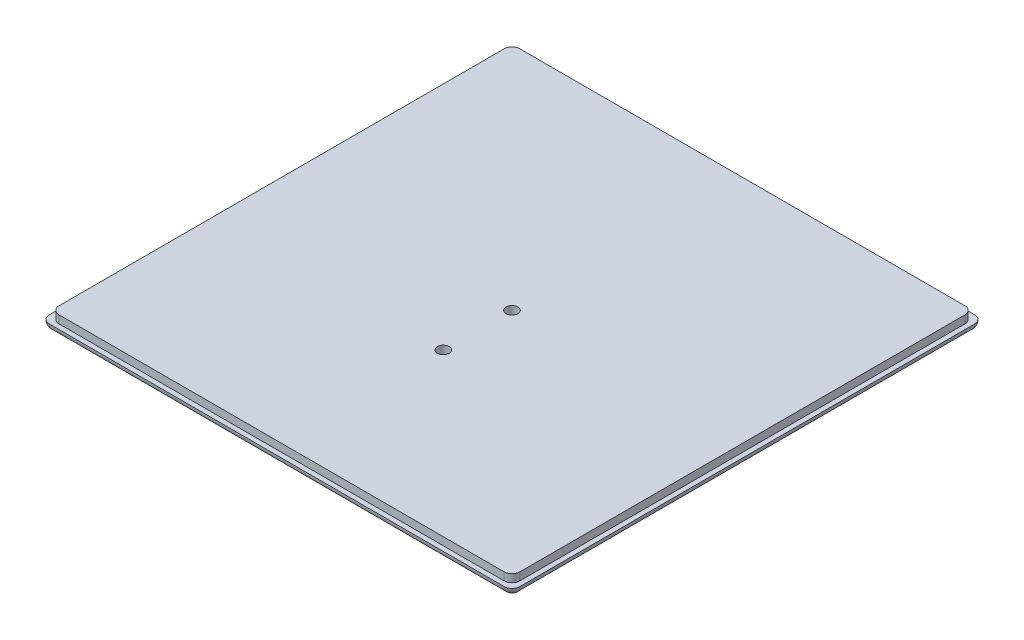
ISO-10303-21;
HEADER;
FILE_DESCRIPTION(('STEP AP214'),'2;1');
FILE_NAME('part.step','',(''),(''),'','','');
FILE_SCHEMA(('AUTOMOTIVE_DESIGN { 1 0 10303 214 1 1 1 1 }'));
ENDSEC;
DATA;
#1=APPLICATION_CONTEXT('core data for automotive mechanical design processes');
#2=APPLICATION_PROTOCOL_DEFINITION('international standard','automotive_design',2000,#1);
#3=PRODUCT_CONTEXT('',#1,'mechanical');
#4=PRODUCT('Part','Part','',(#3));
#5=PRODUCT_RELATED_PRODUCT_CATEGORY('part','',(#4));
#6=PRODUCT_DEFINITION_FORMATION('','',#4);
#7=PRODUCT_DEFINITION_CONTEXT('part definition',#1,'design');
#8=PRODUCT_DEFINITION('design','',#6,#7);
#9=PRODUCT_DEFINITION_SHAPE('','',#8);
#10=(LENGTH_UNIT() NAMED_UNIT(*) SI_UNIT(.MILLI.,.METRE.));
#11=(NAMED_UNIT(*) PLANE_ANGLE_UNIT() SI_UNIT($,.RADIAN.));
#12=(NAMED_UNIT(*) SI_UNIT($,.STERADIAN.) SOLID_ANGLE_UNIT());
#13=UNCERTAINTY_MEASURE_WITH_UNIT(LENGTH_MEASURE(1.E-05),#10,'distance_accuracy_value','');
#14=(GEOMETRIC_REPRESENTATION_CONTEXT(3) GLOBAL_UNCERTAINTY_ASSIGNED_CONTEXT((#13)) GLOBAL_UNIT_ASSIGNED_CONTEXT((#10,
#11,#12)) REPRESENTATION_CONTEXT('',''));
#15=CARTESIAN_POINT('',(0.,0.,0.));
#16=DIRECTION('',(0.,0.,1.));
#17=DIRECTION('',(1.,0.,0.));
#18=AXIS2_PLACEMENT_3D('',#15,#16,#17);
#19=CARTESIAN_POINT('',(0.,2.,0.));
#20=DIRECTION('',(0.,-1.,0.));
#21=DIRECTION('',(0.,0.,-1.));
#22=AXIS2_PLACEMENT_3D('',#19,#20,#21);
#23=PLANE('',#22);
#24=DIRECTION('',(0.,0.,-1.));
#25=VECTOR('',#24,1.);
#26=CARTESIAN_POINT('',(60.,2.,60.));
#27=LINE('',#26,#25);
#28=CARTESIAN_POINT('',(60.,2.,58.));
#29=VERTEX_POINT('',#28);
#30=CARTESIAN_POINT('',(60.,2.,-58.));
#31=VERTEX_POINT('',#30);
#32=EDGE_CURVE('E172',#29,#31,#27,.T.);
#33=ORIENTED_EDGE('',*,*,#32,.T.);
#34=CARTESIAN_POINT('',(58.,2.,-58.));
#35=DIRECTION('',(0.,-1.,0.));
#36=DIRECTION('',(0.,0.,-1.));
#37=AXIS2_PLACEMENT_3D('',#34,#35,#36);
#38=CIRCLE('',#37,2.);
#39=CARTESIAN_POINT('',(58.,2.,-60.));
#40=VERTEX_POINT('',#39);
#41=EDGE_CURVE('E186',#31,#40,#38,.F.);
#42=ORIENTED_EDGE('',*,*,#41,.T.);
#43=DIRECTION('',(-1.,0.,0.));
#44=VECTOR('',#43,1.);
#45=CARTESIAN_POINT('',(-60.,2.,-60.));
#46=LINE('',#45,#44);
#47=CARTESIAN_POINT('',(-58.,2.,-60.));
#48=VERTEX_POINT('',#47);
#49=EDGE_CURVE('E149',#40,#48,#46,.T.);
#50=ORIENTED_EDGE('',*,*,#49,.T.);
#51=CARTESIAN_POINT('',(-58.,2.,-58.));
#52=DIRECTION('',(0.,-1.,0.));
#53=DIRECTION('',(0.,0.,-1.));
#54=AXIS2_PLACEMENT_3D('',#51,#52,#53);
#55=CIRCLE('',#54,2.);
#56=CARTESIAN_POINT('',(-60.,2.,-58.));
#57=VERTEX_POINT('',#56);
#58=EDGE_CURVE('E143',#48,#57,#55,.F.);
#59=ORIENTED_EDGE('',*,*,#58,.T.);
#60=DIRECTION('',(0.,0.,1.));
#61=VECTOR('',#60,1.);
#62=CARTESIAN_POINT('',(-60.,2.,60.));
#63=LINE('',#62,#61);
#64=CARTESIAN_POINT('',(-60.,2.,58.));
#65=VERTEX_POINT('',#64);
#66=EDGE_CURVE('E147',#57,#65,#63,.T.);
#67=ORIENTED_EDGE('',*,*,#66,.T.);
#68=CARTESIAN_POINT('',(-58.,2.,58.));
#69=DIRECTION('',(0.,-1.,0.));
#70=DIRECTION('',(0.,0.,-1.));
#71=AXIS2_PLACEMENT_3D('',#68,#69,#70);
#72=CIRCLE('',#71,2.);
#73=CARTESIAN_POINT('',(-58.,2.,60.));
#74=VERTEX_POINT('',#73);
#75=EDGE_CURVE('E153',#65,#74,#72,.F.);
#76=ORIENTED_EDGE('',*,*,#75,.T.);
#77=DIRECTION('',(1.,0.,0.));
#78=VECTOR('',#77,1.);
#79=CARTESIAN_POINT('',(-60.,2.,60.));
#80=LINE('',#79,#78);
#81=CARTESIAN_POINT('',(58.,2.,60.));
#82=VERTEX_POINT('',#81);
#83=EDGE_CURVE('E168',#74,#82,#80,.T.);
#84=ORIENTED_EDGE('',*,*,#83,.T.);
#85=CARTESIAN_POINT('',(58.,2.,58.));
#86=DIRECTION('',(0.,-1.,0.));
#87=DIRECTION('',(0.,0.,-1.));
#88=AXIS2_PLACEMENT_3D('',#85,#86,#87);
#89=CIRCLE('',#88,2.);
#90=EDGE_CURVE('E184',#82,#29,#89,.F.);
#91=ORIENTED_EDGE('',*,*,#90,.T.);
#92=EDGE_LOOP('',(#33,#42,#50,#59,#67,#76,#84,#91));
#93=FACE_BOUND('',#92,.T.);
#94=DIRECTION('',(0.,0.,-1.));
#95=VECTOR('',#94,1.);
#96=CARTESIAN_POINT('',(58.75,2.,58.75));
#97=LINE('',#96,#95);
#98=CARTESIAN_POINT('',(58.75,2.,56.75));
#99=VERTEX_POINT('',#98);
#100=CARTESIAN_POINT('',(58.75,2.,-56.75));
#101=VERTEX_POINT('',#100);
#102=EDGE_CURVE('E236',#99,#101,#97,.T.);
#103=ORIENTED_EDGE('',*,*,#102,.F.);
#104=CARTESIAN_POINT('',(56.75,2.,56.75));
#105=DIRECTION('',(0.,-1.,0.));
#106=DIRECTION('',(0.,0.,-1.));
#107=AXIS2_PLACEMENT_3D('',#104,#105,#106);
#108=CIRCLE('',#107,2.);
#109=CARTESIAN_POINT('',(56.75,2.,58.75));
#110=VERTEX_POINT('',#109);
#111=EDGE_CURVE('E48',#99,#110,#108,.T.);
#112=ORIENTED_EDGE('',*,*,#111,.T.);
#113=DIRECTION('',(1.,0.,0.));
#114=VECTOR('',#113,1.);
#115=CARTESIAN_POINT('',(-58.75,2.,58.75));
#116=LINE('',#115,#114);
#117=CARTESIAN_POINT('',(-56.75,2.,58.75));
#118=VERTEX_POINT('',#117);
#119=EDGE_CURVE('E256',#118,#110,#116,.T.);
#120=ORIENTED_EDGE('',*,*,#119,.F.);
#121=CARTESIAN_POINT('',(-56.75,2.,56.75));
#122=DIRECTION('',(0.,-1.,0.));
#123=DIRECTION('',(0.,0.,-1.));
#124=AXIS2_PLACEMENT_3D('',#121,#122,#123);
#125=CIRCLE('',#124,2.);
#126=CARTESIAN_POINT('',(-58.75,2.,56.75));
#127=VERTEX_POINT('',#126);
#128=EDGE_CURVE('E11',#118,#127,#125,.T.);
#129=ORIENTED_EDGE('',*,*,#128,.T.);
#130=DIRECTION('',(0.,0.,1.));
#131=VECTOR('',#130,1.);
#132=CARTESIAN_POINT('',(-58.75,2.,58.75));
#133=LINE('',#132,#131);
#134=CARTESIAN_POINT('',(-58.75,2.,-56.75));
#135=VERTEX_POINT('',#134);
#136=EDGE_CURVE('E248',#135,#127,#133,.T.);
#137=ORIENTED_EDGE('',*,*,#136,.F.);
#138=CARTESIAN_POINT('',(-56.75,2.,-56.75));
#139=DIRECTION('',(0.,-1.,0.));
#140=DIRECTION('',(0.,0.,-1.));
#141=AXIS2_PLACEMENT_3D('',#138,#139,#140);
#142=CIRCLE('',#141,2.);
#143=CARTESIAN_POINT('',(-56.75,2.,-58.75));
#144=VERTEX_POINT('',#143);
#145=EDGE_CURVE('E214',#135,#144,#142,.T.);
#146=ORIENTED_EDGE('',*,*,#145,.T.);
#147=DIRECTION('',(-1.,0.,0.));
#148=VECTOR('',#147,1.);
#149=CARTESIAN_POINT('',(-58.75,2.,-58.75));
#150=LINE('',#149,#148);
#151=CARTESIAN_POINT('',(56.75,2.,-58.75));
#152=VERTEX_POINT('',#151);
#153=EDGE_CURVE('E242',#152,#144,#150,.T.);
#154=ORIENTED_EDGE('',*,*,#153,.F.);
#155=CARTESIAN_POINT('',(56.75,2.,-56.75));
#156=DIRECTION('',(0.,-1.,0.));
#157=DIRECTION('',(0.,0.,-1.));
#158=AXIS2_PLACEMENT_3D('',#155,#156,#157);
#159=CIRCLE('',#158,2.);
#160=EDGE_CURVE('E216',#152,#101,#159,.T.);
#161=ORIENTED_EDGE('',*,*,#160,.T.);
#162=EDGE_LOOP('',(#103,#112,#120,#129,#137,#146,#154,#161));
#163=FACE_BOUND('',#162,.T.);
#164=ADVANCED_FACE('F39',(#93,#163),#23,.F.);
#165=CARTESIAN_POINT('',(0.,0.,0.));
#166=DIRECTION('',(0.,-1.,0.));
#167=DIRECTION('',(0.,0.,-1.));
#168=AXIS2_PLACEMENT_3D('',#165,#166,#167);
#169=PLANE('',#168);
#170=CARTESIAN_POINT('',(0.,0.,0.));
#171=DIRECTION('',(0.,-1.,0.));
#172=DIRECTION('',(0.,0.,-1.));
#173=AXIS2_PLACEMENT_3D('',#170,#171,#172);
#174=CIRCLE('',#173,1.5);
#175=CARTESIAN_POINT('',(0.,0.,-1.5));
#176=VERTEX_POINT('',#175);
#177=EDGE_CURVE('E274',#176,#176,#174,.T.);
#178=ORIENTED_EDGE('',*,*,#177,.F.);
#179=EDGE_LOOP('',(#178));
#180=FACE_BOUND('',#179,.T.);
#181=CARTESIAN_POINT('',(0.,0.,17.5));
#182=DIRECTION('',(0.,-1.,0.));
#183=DIRECTION('',(0.,0.,-1.));
#184=AXIS2_PLACEMENT_3D('',#181,#182,#183);
#185=CIRCLE('',#184,1.5);
#186=CARTESIAN_POINT('',(0.,0.,16.));
#187=VERTEX_POINT('',#186);
#188=EDGE_CURVE('E271',#187,#187,#185,.T.);
#189=ORIENTED_EDGE('',*,*,#188,.F.);
#190=EDGE_LOOP('',(#189));
#191=FACE_BOUND('',#190,.T.);
#192=DIRECTION('',(1.,0.,0.));
#193=VECTOR('',#192,1.);
#194=CARTESIAN_POINT('',(-60.,0.,58.));
#195=LINE('',#194,#193);
#196=CARTESIAN_POINT('',(58.,0.,58.));
#197=VERTEX_POINT('',#196);
#198=CARTESIAN_POINT('',(-58.,0.,58.));
#199=VERTEX_POINT('',#198);
#200=EDGE_CURVE('E179',#197,#199,#195,.F.);
#201=ORIENTED_EDGE('',*,*,#200,.T.);
#202=DIRECTION('',(0.,0.,1.));
#203=VECTOR('',#202,1.);
#204=CARTESIAN_POINT('',(-58.,0.,-60.));
#205=LINE('',#204,#203);
#206=CARTESIAN_POINT('',(-58.,0.,-58.));
#207=VERTEX_POINT('',#206);
#208=EDGE_CURVE('E154',#199,#207,#205,.F.);
#209=ORIENTED_EDGE('',*,*,#208,.T.);
#210=DIRECTION('',(-1.,0.,0.));
#211=VECTOR('',#210,1.);
#212=CARTESIAN_POINT('',(60.,0.,-58.));
#213=LINE('',#212,#211);
#214=CARTESIAN_POINT('',(58.,0.,-58.));
#215=VERTEX_POINT('',#214);
#216=EDGE_CURVE('E177',#207,#215,#213,.F.);
#217=ORIENTED_EDGE('',*,*,#216,.T.);
#218=DIRECTION('',(0.,0.,-1.));
#219=VECTOR('',#218,1.);
#220=CARTESIAN_POINT('',(58.,0.,60.));
#221=LINE('',#220,#219);
#222=EDGE_CURVE('E170',#215,#197,#221,.F.);
#223=ORIENTED_EDGE('',*,*,#222,.T.);
#224=EDGE_LOOP('',(#201,#209,#217,#223));
#225=FACE_BOUND('',#224,.T.);
#226=ADVANCED_FACE('F290',(#180,#191,#225),#169,.T.);
#227=CARTESIAN_POINT('',(58.75,4.,58.75));
#228=DIRECTION('',(-1.,0.,0.));
#229=DIRECTION('',(0.,0.,1.));
#230=AXIS2_PLACEMENT_3D('',#227,#228,#229);
#231=PLANE('',#230);
#232=ORIENTED_EDGE('',*,*,#102,.T.);
#233=DIRECTION('',(0.,-1.,0.));
#234=VECTOR('',#233,1.);
#235=CARTESIAN_POINT('',(58.75,4.,-56.75));
#236=LINE('',#235,#234);
#237=CARTESIAN_POINT('',(58.75,4.,-56.75));
#238=VERTEX_POINT('',#237);
#239=EDGE_CURVE('E208',#101,#238,#236,.F.);
#240=ORIENTED_EDGE('',*,*,#239,.T.);
#241=DIRECTION('',(0.,0.,-1.));
#242=VECTOR('',#241,1.);
#243=CARTESIAN_POINT('',(58.75,4.,58.75));
#244=LINE('',#243,#242);
#245=CARTESIAN_POINT('',(58.75,4.,56.75));
#246=VERTEX_POINT('',#245);
#247=EDGE_CURVE('E257',#246,#238,#244,.T.);
#248=ORIENTED_EDGE('',*,*,#247,.F.);
#249=DIRECTION('',(0.,-1.,0.));
#250=VECTOR('',#249,1.);
#251=CARTESIAN_POINT('',(58.75,4.,56.75));
#252=LINE('',#251,#250);
#253=EDGE_CURVE('E205',#246,#99,#252,.T.);
#254=ORIENTED_EDGE('',*,*,#253,.T.);
#255=EDGE_LOOP('',(#232,#240,#248,#254));
#256=FACE_BOUND('',#255,.T.);
#257=ADVANCED_FACE('F293',(#256),#231,.F.);
#258=CARTESIAN_POINT('',(-58.75,4.,-58.75));
#259=DIRECTION('',(0.,0.,1.));
#260=DIRECTION('',(1.,0.,0.));
#261=AXIS2_PLACEMENT_3D('',#258,#259,#260);
#262=PLANE('',#261);
#263=ORIENTED_EDGE('',*,*,#153,.T.);
#264=DIRECTION('',(0.,-1.,0.));
#265=VECTOR('',#264,1.);
#266=CARTESIAN_POINT('',(-56.75,4.,-58.75));
#267=LINE('',#266,#265);
#268=CARTESIAN_POINT('',(-56.75,4.,-58.75));
#269=VERTEX_POINT('',#268);
#270=EDGE_CURVE('E196',#144,#269,#267,.F.);
#271=ORIENTED_EDGE('',*,*,#270,.T.);
#272=DIRECTION('',(-1.,0.,0.));
#273=VECTOR('',#272,1.);
#274=CARTESIAN_POINT('',(-58.75,4.,-58.75));
#275=LINE('',#274,#273);
#276=CARTESIAN_POINT('',(56.75,4.,-58.75));
#277=VERTEX_POINT('',#276);
#278=EDGE_CURVE('E261',#277,#269,#275,.T.);
#279=ORIENTED_EDGE('',*,*,#278,.F.);
#280=DIRECTION('',(0.,-1.,0.));
#281=VECTOR('',#280,1.);
#282=CARTESIAN_POINT('',(56.75,4.,-58.75));
#283=LINE('',#282,#281);
#284=EDGE_CURVE('E193',#277,#152,#283,.T.);
#285=ORIENTED_EDGE('',*,*,#284,.T.);
#286=EDGE_LOOP('',(#263,#271,#279,#285));
#287=FACE_BOUND('',#286,.T.);
#288=ADVANCED_FACE('F460',(#287),#262,.F.);
#289=CARTESIAN_POINT('',(-58.75,4.,58.75));
#290=DIRECTION('',(1.,0.,0.));
#291=DIRECTION('',(0.,0.,-1.));
#292=AXIS2_PLACEMENT_3D('',#289,#290,#291);
#293=PLANE('',#292);
#294=DIRECTION('',(0.,0.,1.));
#295=VECTOR('',#294,1.);
#296=CARTESIAN_POINT('',(-58.75,4.,58.75));
#297=LINE('',#296,#295);
#298=CARTESIAN_POINT('',(-58.75,4.,-56.75));
#299=VERTEX_POINT('',#298);
#300=CARTESIAN_POINT('',(-58.75,4.,56.75));
#301=VERTEX_POINT('',#300);
#302=EDGE_CURVE('E259',#299,#301,#297,.T.);
#303=ORIENTED_EDGE('',*,*,#302,.F.);
#304=DIRECTION('',(0.,-1.,0.));
#305=VECTOR('',#304,1.);
#306=CARTESIAN_POINT('',(-58.75,4.,-56.75));
#307=LINE('',#306,#305);
#308=EDGE_CURVE('E190',#299,#135,#307,.T.);
#309=ORIENTED_EDGE('',*,*,#308,.T.);
#310=ORIENTED_EDGE('',*,*,#136,.T.);
#311=DIRECTION('',(0.,-1.,0.));
#312=VECTOR('',#311,1.);
#313=CARTESIAN_POINT('',(-58.75,4.,56.75));
#314=LINE('',#313,#312);
#315=EDGE_CURVE('E188',#127,#301,#314,.F.);
#316=ORIENTED_EDGE('',*,*,#315,.T.);
#317=EDGE_LOOP('',(#303,#309,#310,#316));
#318=FACE_BOUND('',#317,.T.);
#319=ADVANCED_FACE('F452',(#318),#293,.F.);
#320=CARTESIAN_POINT('',(-58.75,4.,58.75));
#321=DIRECTION('',(0.,0.,-1.));
#322=DIRECTION('',(-1.,0.,0.));
#323=AXIS2_PLACEMENT_3D('',#320,#321,#322);
#324=PLANE('',#323);
#325=ORIENTED_EDGE('',*,*,#119,.T.);
#326=DIRECTION('',(0.,-1.,0.));
#327=VECTOR('',#326,1.);
#328=CARTESIAN_POINT('',(56.75,4.,58.75));
#329=LINE('',#328,#327);
#330=CARTESIAN_POINT('',(56.75,4.,58.75));
#331=VERTEX_POINT('',#330);
#332=EDGE_CURVE('E56',#110,#331,#329,.F.);
#333=ORIENTED_EDGE('',*,*,#332,.T.);
#334=DIRECTION('',(1.,0.,0.));
#335=VECTOR('',#334,1.);
#336=CARTESIAN_POINT('',(-58.75,4.,58.75));
#337=LINE('',#336,#335);
#338=CARTESIAN_POINT('',(-56.75,4.,58.75));
#339=VERTEX_POINT('',#338);
#340=EDGE_CURVE('E251',#339,#331,#337,.T.);
#341=ORIENTED_EDGE('',*,*,#340,.F.);
#342=DIRECTION('',(0.,-1.,0.));
#343=VECTOR('',#342,1.);
#344=CARTESIAN_POINT('',(-56.75,4.,58.75));
#345=LINE('',#344,#343);
#346=EDGE_CURVE('E210',#339,#118,#345,.T.);
#347=ORIENTED_EDGE('',*,*,#346,.T.);
#348=EDGE_LOOP('',(#325,#333,#341,#347));
#349=FACE_BOUND('',#348,.T.);
#350=ADVANCED_FACE('F399',(#349),#324,.F.);
#351=CARTESIAN_POINT('',(0.,4.,0.));
#352=DIRECTION('',(0.,-1.,0.));
#353=DIRECTION('',(0.,0.,-1.));
#354=AXIS2_PLACEMENT_3D('',#351,#352,#353);
#355=PLANE('',#354);
#356=CARTESIAN_POINT('',(0.,4.,0.));
#357=DIRECTION('',(0.,-1.,0.));
#358=DIRECTION('',(0.,0.,-1.));
#359=AXIS2_PLACEMENT_3D('',#356,#357,#358);
#360=CIRCLE('',#359,1.5);
#361=CARTESIAN_POINT('',(0.,4.,-1.5));
#362=VERTEX_POINT('',#361);
#363=EDGE_CURVE('E219',#362,#362,#360,.T.);
#364=ORIENTED_EDGE('',*,*,#363,.T.);
#365=EDGE_LOOP('',(#364));
#366=FACE_BOUND('',#365,.T.);
#367=CARTESIAN_POINT('',(0.,4.,17.5));
#368=DIRECTION('',(0.,-1.,0.));
#369=DIRECTION('',(0.,0.,-1.));
#370=AXIS2_PLACEMENT_3D('',#367,#368,#369);
#371=CIRCLE('',#370,1.5);
#372=CARTESIAN_POINT('',(0.,4.,16.));
#373=VERTEX_POINT('',#372);
#374=EDGE_CURVE('E268',#373,#373,#371,.T.);
#375=ORIENTED_EDGE('',*,*,#374,.T.);
#376=EDGE_LOOP('',(#375));
#377=FACE_BOUND('',#376,.T.);
#378=ORIENTED_EDGE('',*,*,#278,.T.);
#379=CARTESIAN_POINT('',(-56.75,4.,-56.75));
#380=DIRECTION('',(0.,-1.,0.));
#381=DIRECTION('',(0.,0.,-1.));
#382=AXIS2_PLACEMENT_3D('',#379,#380,#381);
#383=CIRCLE('',#382,2.);
#384=EDGE_CURVE('E203',#269,#299,#383,.F.);
#385=ORIENTED_EDGE('',*,*,#384,.T.);
#386=ORIENTED_EDGE('',*,*,#302,.T.);
#387=CARTESIAN_POINT('',(-56.75,4.,56.75));
#388=DIRECTION('',(0.,-1.,0.));
#389=DIRECTION('',(0.,0.,-1.));
#390=AXIS2_PLACEMENT_3D('',#387,#388,#389);
#391=CIRCLE('',#390,2.);
#392=EDGE_CURVE('E63',#301,#339,#391,.F.);
#393=ORIENTED_EDGE('',*,*,#392,.T.);
#394=ORIENTED_EDGE('',*,*,#340,.T.);
#395=CARTESIAN_POINT('',(56.75,4.,56.75));
#396=DIRECTION('',(0.,-1.,0.));
#397=DIRECTION('',(0.,0.,-1.));
#398=AXIS2_PLACEMENT_3D('',#395,#396,#397);
#399=CIRCLE('',#398,2.);
#400=EDGE_CURVE('E199',#331,#246,#399,.F.);
#401=ORIENTED_EDGE('',*,*,#400,.T.);
#402=ORIENTED_EDGE('',*,*,#247,.T.);
#403=CARTESIAN_POINT('',(56.75,4.,-56.75));
#404=DIRECTION('',(0.,-1.,0.));
#405=DIRECTION('',(0.,0.,-1.));
#406=AXIS2_PLACEMENT_3D('',#403,#404,#405);
#407=CIRCLE('',#406,2.);
#408=EDGE_CURVE('E201',#238,#277,#407,.F.);
#409=ORIENTED_EDGE('',*,*,#408,.T.);
#410=EDGE_LOOP('',(#378,#385,#386,#393,#394,#401,#402,#409));
#411=FACE_BOUND('',#410,.T.);
#412=ADVANCED_FACE('F280',(#366,#377,#411),#355,.F.);
#413=CARTESIAN_POINT('',(58.,2.,60.));
#414=DIRECTION('',(0.,0.,1.));
#415=DIRECTION('',(1.,0.,0.));
#416=AXIS2_PLACEMENT_3D('',#413,#414,#415);
#417=CYLINDRICAL_SURFACE('',#416,2.);
#418=CARTESIAN_POINT('',(58.,2.,-58.));
#419=DIRECTION('',(0.,0.,-1.));
#420=DIRECTION('',(-1.,0.,0.));
#421=AXIS2_PLACEMENT_3D('',#418,#419,#420);
#422=CIRCLE('',#421,2.);
#423=EDGE_CURVE('E43',#31,#215,#422,.T.);
#424=ORIENTED_EDGE('',*,*,#423,.F.);
#425=ORIENTED_EDGE('',*,*,#32,.F.);
#426=CARTESIAN_POINT('',(58.,2.,58.));
#427=DIRECTION('',(0.,0.,1.));
#428=DIRECTION('',(1.,0.,0.));
#429=AXIS2_PLACEMENT_3D('',#426,#427,#428);
#430=CIRCLE('',#429,2.);
#431=EDGE_CURVE('E229',#197,#29,#430,.T.);
#432=ORIENTED_EDGE('',*,*,#431,.F.);
#433=ORIENTED_EDGE('',*,*,#222,.F.);
#434=EDGE_LOOP('',(#424,#425,#432,#433));
#435=FACE_BOUND('',#434,.T.);
#436=ADVANCED_FACE('F316',(#435),#417,.T.);
#437=CARTESIAN_POINT('',(58.,2.,-58.));
#438=DIRECTION('',(1.,0.,0.));
#439=DIRECTION('',(0.,0.,-1.));
#440=AXIS2_PLACEMENT_3D('',#437,#438,#439);
#441=SPHERICAL_SURFACE('',#440,2.);
#442=ORIENTED_EDGE('',*,*,#41,.F.);
#443=ORIENTED_EDGE('',*,*,#423,.T.);
#444=CARTESIAN_POINT('',(58.,2.,-58.));
#445=DIRECTION('',(1.,0.,0.));
#446=DIRECTION('',(0.,0.,-1.));
#447=AXIS2_PLACEMENT_3D('',#444,#445,#446);
#448=CIRCLE('',#447,2.);
#449=EDGE_CURVE('E227',#40,#215,#448,.F.);
#450=ORIENTED_EDGE('',*,*,#449,.F.);
#451=EDGE_LOOP('',(#442,#443,#450));
#452=FACE_BOUND('',#451,.T.);
#453=ADVANCED_FACE('F308',(#452),#441,.T.);
#454=CARTESIAN_POINT('',(58.,2.,58.));
#455=DIRECTION('',(1.,0.,0.));
#456=DIRECTION('',(0.,0.,-1.));
#457=AXIS2_PLACEMENT_3D('',#454,#455,#456);
#458=SPHERICAL_SURFACE('',#457,2.);
#459=ORIENTED_EDGE('',*,*,#431,.T.);
#460=ORIENTED_EDGE('',*,*,#90,.F.);
#461=CARTESIAN_POINT('',(58.,2.,58.));
#462=DIRECTION('',(1.,0.,0.));
#463=DIRECTION('',(0.,0.,-1.));
#464=AXIS2_PLACEMENT_3D('',#461,#462,#463);
#465=CIRCLE('',#464,2.);
#466=EDGE_CURVE('E224',#197,#82,#465,.F.);
#467=ORIENTED_EDGE('',*,*,#466,.F.);
#468=EDGE_LOOP('',(#459,#460,#467));
#469=FACE_BOUND('',#468,.T.);
#470=ADVANCED_FACE('F305',(#469),#458,.T.);
#471=CARTESIAN_POINT('',(-60.,2.,-58.));
#472=DIRECTION('',(1.,0.,0.));
#473=DIRECTION('',(0.,0.,-1.));
#474=AXIS2_PLACEMENT_3D('',#471,#472,#473);
#475=CYLINDRICAL_SURFACE('',#474,2.);
#476=ORIENTED_EDGE('',*,*,#449,.T.);
#477=ORIENTED_EDGE('',*,*,#216,.F.);
#478=CARTESIAN_POINT('',(-58.,2.,-58.));
#479=DIRECTION('',(-1.,0.,0.));
#480=DIRECTION('',(0.,0.,1.));
#481=AXIS2_PLACEMENT_3D('',#478,#479,#480);
#482=CIRCLE('',#481,2.);
#483=EDGE_CURVE('E158',#48,#207,#482,.T.);
#484=ORIENTED_EDGE('',*,*,#483,.F.);
#485=ORIENTED_EDGE('',*,*,#49,.F.);
#486=EDGE_LOOP('',(#476,#477,#484,#485));
#487=FACE_BOUND('',#486,.T.);
#488=ADVANCED_FACE('F307',(#487),#475,.T.);
#489=CARTESIAN_POINT('',(-60.,2.,58.));
#490=DIRECTION('',(-1.,0.,0.));
#491=DIRECTION('',(0.,0.,1.));
#492=AXIS2_PLACEMENT_3D('',#489,#490,#491);
#493=CYLINDRICAL_SURFACE('',#492,2.);
#494=ORIENTED_EDGE('',*,*,#466,.T.);
#495=ORIENTED_EDGE('',*,*,#83,.F.);
#496=CARTESIAN_POINT('',(-58.,2.,58.));
#497=DIRECTION('',(-1.,0.,0.));
#498=DIRECTION('',(0.,0.,1.));
#499=AXIS2_PLACEMENT_3D('',#496,#497,#498);
#500=CIRCLE('',#499,2.);
#501=EDGE_CURVE('E162',#199,#74,#500,.T.);
#502=ORIENTED_EDGE('',*,*,#501,.F.);
#503=ORIENTED_EDGE('',*,*,#200,.F.);
#504=EDGE_LOOP('',(#494,#495,#502,#503));
#505=FACE_BOUND('',#504,.T.);
#506=ADVANCED_FACE('F302',(#505),#493,.T.);
#507=CARTESIAN_POINT('',(-58.,2.,-58.));
#508=DIRECTION('',(0.,0.,-1.));
#509=DIRECTION('',(-1.,0.,0.));
#510=AXIS2_PLACEMENT_3D('',#507,#508,#509);
#511=SPHERICAL_SURFACE('',#510,2.);
#512=ORIENTED_EDGE('',*,*,#58,.F.);
#513=ORIENTED_EDGE('',*,*,#483,.T.);
#514=CARTESIAN_POINT('',(-58.,2.,-58.));
#515=DIRECTION('',(0.,0.,-1.));
#516=DIRECTION('',(-1.,0.,0.));
#517=AXIS2_PLACEMENT_3D('',#514,#515,#516);
#518=CIRCLE('',#517,2.);
#519=EDGE_CURVE('E156',#57,#207,#518,.F.);
#520=ORIENTED_EDGE('',*,*,#519,.F.);
#521=EDGE_LOOP('',(#512,#513,#520));
#522=FACE_BOUND('',#521,.T.);
#523=ADVANCED_FACE('F157',(#522),#511,.T.);
#524=CARTESIAN_POINT('',(-58.,2.,58.));
#525=DIRECTION('',(0.,0.,1.));
#526=DIRECTION('',(1.,0.,0.));
#527=AXIS2_PLACEMENT_3D('',#524,#525,#526);
#528=SPHERICAL_SURFACE('',#527,2.);
#529=ORIENTED_EDGE('',*,*,#501,.T.);
#530=ORIENTED_EDGE('',*,*,#75,.F.);
#531=CARTESIAN_POINT('',(-58.,2.,58.));
#532=DIRECTION('',(0.,0.,1.));
#533=DIRECTION('',(1.,0.,0.));
#534=AXIS2_PLACEMENT_3D('',#531,#532,#533);
#535=CIRCLE('',#534,2.);
#536=EDGE_CURVE('E163',#199,#65,#535,.F.);
#537=ORIENTED_EDGE('',*,*,#536,.F.);
#538=EDGE_LOOP('',(#529,#530,#537));
#539=FACE_BOUND('',#538,.T.);
#540=ADVANCED_FACE('F304',(#539),#528,.T.);
#541=CARTESIAN_POINT('',(-58.,2.,60.));
#542=DIRECTION('',(0.,0.,-1.));
#543=DIRECTION('',(-1.,0.,0.));
#544=AXIS2_PLACEMENT_3D('',#541,#542,#543);
#545=CYLINDRICAL_SURFACE('',#544,2.);
#546=ORIENTED_EDGE('',*,*,#519,.T.);
#547=ORIENTED_EDGE('',*,*,#208,.F.);
#548=ORIENTED_EDGE('',*,*,#536,.T.);
#549=ORIENTED_EDGE('',*,*,#66,.F.);
#550=EDGE_LOOP('',(#546,#547,#548,#549));
#551=FACE_BOUND('',#550,.T.);
#552=ADVANCED_FACE('F165',(#551),#545,.T.);
#553=CARTESIAN_POINT('',(-56.75,4.,-56.75));
#554=DIRECTION('',(0.,-1.,0.));
#555=DIRECTION('',(0.,0.,-1.));
#556=AXIS2_PLACEMENT_3D('',#553,#554,#555);
#557=CYLINDRICAL_SURFACE('',#556,2.);
#558=ORIENTED_EDGE('',*,*,#384,.F.);
#559=ORIENTED_EDGE('',*,*,#270,.F.);
#560=ORIENTED_EDGE('',*,*,#145,.F.);
#561=ORIENTED_EDGE('',*,*,#308,.F.);
#562=EDGE_LOOP('',(#558,#559,#560,#561));
#563=FACE_BOUND('',#562,.T.);
#564=ADVANCED_FACE('F328',(#563),#557,.T.);
#565=CARTESIAN_POINT('',(56.75,4.,-56.75));
#566=DIRECTION('',(0.,-1.,0.));
#567=DIRECTION('',(0.,0.,-1.));
#568=AXIS2_PLACEMENT_3D('',#565,#566,#567);
#569=CYLINDRICAL_SURFACE('',#568,2.);
#570=ORIENTED_EDGE('',*,*,#408,.F.);
#571=ORIENTED_EDGE('',*,*,#239,.F.);
#572=ORIENTED_EDGE('',*,*,#160,.F.);
#573=ORIENTED_EDGE('',*,*,#284,.F.);
#574=EDGE_LOOP('',(#570,#571,#572,#573));
#575=FACE_BOUND('',#574,.T.);
#576=ADVANCED_FACE('F360',(#575),#569,.T.);
#577=CARTESIAN_POINT('',(56.75,4.,56.75));
#578=DIRECTION('',(0.,-1.,0.));
#579=DIRECTION('',(0.,0.,-1.));
#580=AXIS2_PLACEMENT_3D('',#577,#578,#579);
#581=CYLINDRICAL_SURFACE('',#580,2.);
#582=ORIENTED_EDGE('',*,*,#400,.F.);
#583=ORIENTED_EDGE('',*,*,#332,.F.);
#584=ORIENTED_EDGE('',*,*,#111,.F.);
#585=ORIENTED_EDGE('',*,*,#253,.F.);
#586=EDGE_LOOP('',(#582,#583,#584,#585));
#587=FACE_BOUND('',#586,.T.);
#588=ADVANCED_FACE('F369',(#587),#581,.T.);
#589=CARTESIAN_POINT('',(-56.75,4.,56.75));
#590=DIRECTION('',(0.,-1.,0.));
#591=DIRECTION('',(0.,0.,-1.));
#592=AXIS2_PLACEMENT_3D('',#589,#590,#591);
#593=CYLINDRICAL_SURFACE('',#592,2.);
#594=ORIENTED_EDGE('',*,*,#392,.F.);
#595=ORIENTED_EDGE('',*,*,#315,.F.);
#596=ORIENTED_EDGE('',*,*,#128,.F.);
#597=ORIENTED_EDGE('',*,*,#346,.F.);
#598=EDGE_LOOP('',(#594,#595,#596,#597));
#599=FACE_BOUND('',#598,.T.);
#600=ADVANCED_FACE('F41',(#599),#593,.T.);
#601=CARTESIAN_POINT('',(0.,4.,17.5));
#602=DIRECTION('',(0.,-1.,0.));
#603=DIRECTION('',(0.,0.,-1.));
#604=AXIS2_PLACEMENT_3D('',#601,#602,#603);
#605=CYLINDRICAL_SURFACE('',#604,1.5);
#606=ORIENTED_EDGE('',*,*,#374,.F.);
#607=EDGE_LOOP('',(#606));
#608=FACE_BOUND('',#607,.T.);
#609=ORIENTED_EDGE('',*,*,#188,.T.);
#610=EDGE_LOOP('',(#609));
#611=FACE_BOUND('',#610,.T.);
#612=ADVANCED_FACE('F286',(#608,#611),#605,.F.);
#613=CARTESIAN_POINT('',(0.,4.,0.));
#614=DIRECTION('',(0.,-1.,0.));
#615=DIRECTION('',(0.,0.,-1.));
#616=AXIS2_PLACEMENT_3D('',#613,#614,#615);
#617=CYLINDRICAL_SURFACE('',#616,1.5);
#618=ORIENTED_EDGE('',*,*,#363,.F.);
#619=EDGE_LOOP('',(#618));
#620=FACE_BOUND('',#619,.T.);
#621=ORIENTED_EDGE('',*,*,#177,.T.);
#622=EDGE_LOOP('',(#621));
#623=FACE_BOUND('',#622,.T.);
#624=ADVANCED_FACE('F283',(#620,#623),#617,.F.);
#625=CLOSED_SHELL('',(#164,#226,#257,#288,#319,#350,#412,#436,#453,#470,#488,#506,#523,#540,
#552,#564,#576,#588,#600,#612,#624));
#626=MANIFOLD_SOLID_BREP('B2',#625);
#627=ADVANCED_BREP_SHAPE_REPRESENTATION('',(#18,#626),#14);
#628=SHAPE_DEFINITION_REPRESENTATION(#9,#627);
ENDSEC;
END-ISO-10303-21;
